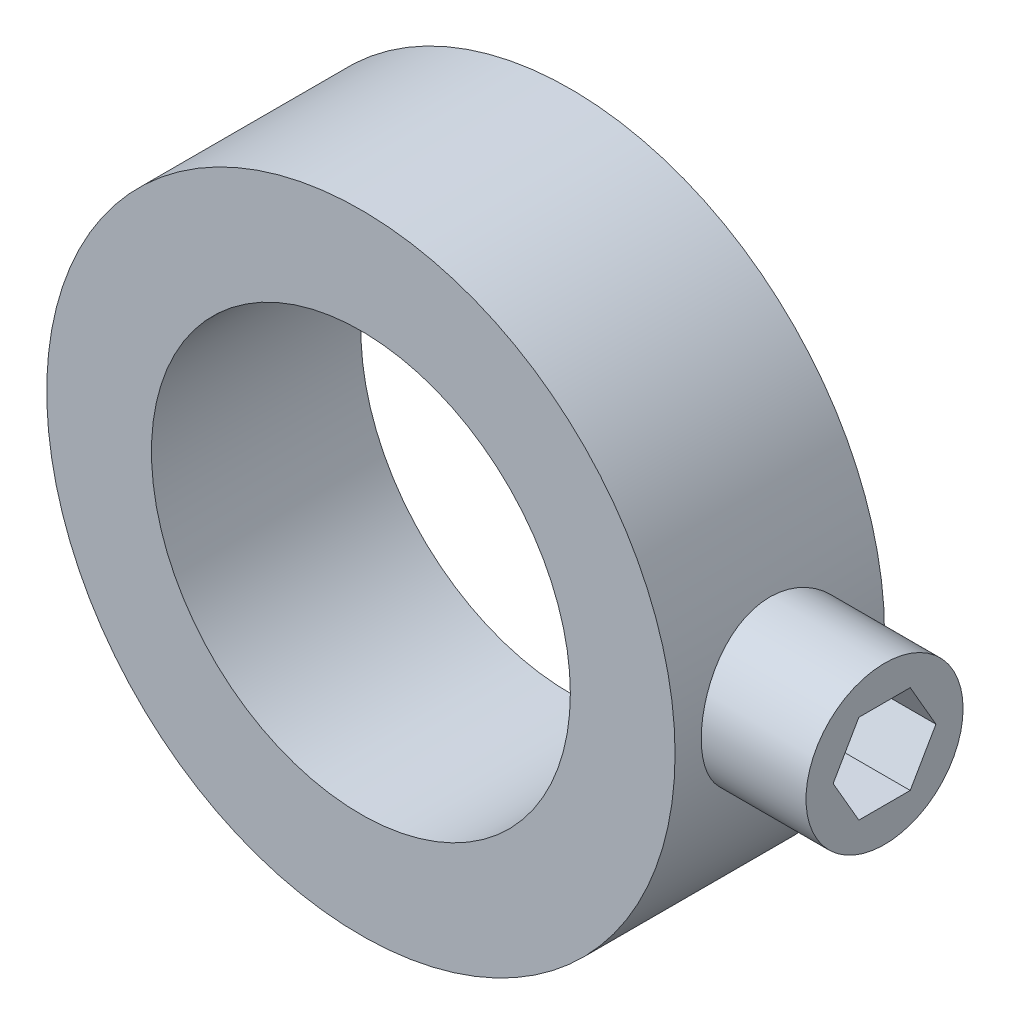
ISO-10303-21;
HEADER;
FILE_DESCRIPTION(('STEP AP214'),'2;1');
FILE_NAME('part.step','',(''),(''),'','','');
FILE_SCHEMA(('AUTOMOTIVE_DESIGN { 1 0 10303 214 1 1 1 1 }'));
ENDSEC;
DATA;
#1=APPLICATION_CONTEXT('core data for automotive mechanical design processes');
#2=APPLICATION_PROTOCOL_DEFINITION('international standard','automotive_design',2000,#1);
#3=PRODUCT_CONTEXT('',#1,'mechanical');
#4=PRODUCT('Part','Part','',(#3));
#5=PRODUCT_RELATED_PRODUCT_CATEGORY('part','',(#4));
#6=PRODUCT_DEFINITION_FORMATION('','',#4);
#7=PRODUCT_DEFINITION_CONTEXT('part definition',#1,'design');
#8=PRODUCT_DEFINITION('design','',#6,#7);
#9=PRODUCT_DEFINITION_SHAPE('','',#8);
#10=(LENGTH_UNIT() NAMED_UNIT(*) SI_UNIT(.MILLI.,.METRE.));
#11=(NAMED_UNIT(*) PLANE_ANGLE_UNIT() SI_UNIT($,.RADIAN.));
#12=(NAMED_UNIT(*) SI_UNIT($,.STERADIAN.) SOLID_ANGLE_UNIT());
#13=UNCERTAINTY_MEASURE_WITH_UNIT(LENGTH_MEASURE(1.E-05),#10,'distance_accuracy_value','');
#14=(GEOMETRIC_REPRESENTATION_CONTEXT(3) GLOBAL_UNCERTAINTY_ASSIGNED_CONTEXT((#13)) GLOBAL_UNIT_ASSIGNED_CONTEXT((#10,
#11,#12)) REPRESENTATION_CONTEXT('',''));
#15=CARTESIAN_POINT('',(0.,0.,0.));
#16=DIRECTION('',(0.,0.,1.));
#17=DIRECTION('',(1.,0.,0.));
#18=AXIS2_PLACEMENT_3D('',#15,#16,#17);
#19=CARTESIAN_POINT('',(0.,0.,4.));
#20=DIRECTION('',(0.,0.,1.));
#21=DIRECTION('',(1.,0.,0.));
#22=AXIS2_PLACEMENT_3D('',#19,#20,#21);
#23=PLANE('',#22);
#24=CARTESIAN_POINT('',(0.,0.,4.));
#25=DIRECTION('',(0.,0.,1.));
#26=DIRECTION('',(1.,0.,0.));
#27=AXIS2_PLACEMENT_3D('',#24,#25,#26);
#28=CIRCLE('',#27,6.);
#29=CARTESIAN_POINT('',(6.,0.,4.));
#30=VERTEX_POINT('',#29);
#31=EDGE_CURVE('E11',#30,#30,#28,.T.);
#32=ORIENTED_EDGE('',*,*,#31,.T.);
#33=EDGE_LOOP('',(#32));
#34=FACE_BOUND('',#33,.T.);
#35=CARTESIAN_POINT('',(0.,0.,4.));
#36=DIRECTION('',(0.,0.,1.));
#37=DIRECTION('',(1.,0.,0.));
#38=AXIS2_PLACEMENT_3D('',#35,#36,#37);
#39=CIRCLE('',#38,4.);
#40=CARTESIAN_POINT('',(4.,0.,4.));
#41=VERTEX_POINT('',#40);
#42=EDGE_CURVE('E151',#41,#41,#39,.T.);
#43=ORIENTED_EDGE('',*,*,#42,.F.);
#44=EDGE_LOOP('',(#43));
#45=FACE_BOUND('',#44,.T.);
#46=ADVANCED_FACE('F35',(#34,#45),#23,.T.);
#47=CARTESIAN_POINT('',(0.,0.,0.));
#48=DIRECTION('',(0.,0.,1.));
#49=DIRECTION('',(1.,0.,0.));
#50=AXIS2_PLACEMENT_3D('',#47,#48,#49);
#51=PLANE('',#50);
#52=CARTESIAN_POINT('',(0.,0.,0.));
#53=DIRECTION('',(0.,0.,1.));
#54=DIRECTION('',(1.,0.,0.));
#55=AXIS2_PLACEMENT_3D('',#52,#53,#54);
#56=CIRCLE('',#55,6.);
#57=CARTESIAN_POINT('',(6.,0.,0.));
#58=VERTEX_POINT('',#57);
#59=EDGE_CURVE('E48',#58,#58,#56,.T.);
#60=ORIENTED_EDGE('',*,*,#59,.F.);
#61=EDGE_LOOP('',(#60));
#62=FACE_BOUND('',#61,.T.);
#63=CARTESIAN_POINT('',(0.,0.,0.));
#64=DIRECTION('',(0.,0.,1.));
#65=DIRECTION('',(1.,0.,0.));
#66=AXIS2_PLACEMENT_3D('',#63,#64,#65);
#67=CIRCLE('',#66,4.);
#68=CARTESIAN_POINT('',(4.,0.,0.));
#69=VERTEX_POINT('',#68);
#70=EDGE_CURVE('E154',#69,#69,#67,.T.);
#71=ORIENTED_EDGE('',*,*,#70,.T.);
#72=EDGE_LOOP('',(#71));
#73=FACE_BOUND('',#72,.T.);
#74=ADVANCED_FACE('F160',(#62,#73),#51,.F.);
#75=CARTESIAN_POINT('',(0.,0.,4.));
#76=DIRECTION('',(0.,0.,-1.));
#77=DIRECTION('',(-1.,0.,0.));
#78=AXIS2_PLACEMENT_3D('',#75,#76,#77);
#79=CYLINDRICAL_SURFACE('',#78,6.);
#80=CARTESIAN_POINT('',(6.,0.,0.499999999999998));
#81=CARTESIAN_POINT('',(5.99999859868013,-0.0828760886697311,0.500002325738157));
#82=CARTESIAN_POINT('',(5.99826578131828,-0.165778157830763,0.506891550773786));
#83=CARTESIAN_POINT('',(5.99152113829892,-0.329206323770533,0.534225151307003));
#84=CARTESIAN_POINT('',(5.98650745419968,-0.409731046870739,0.554677209537846));
#85=CARTESIAN_POINT('',(5.9737562633204,-0.566020872182577,0.608439253462086));
#86=CARTESIAN_POINT('',(5.96602202842087,-0.641791563430003,0.641733798715276));
#87=CARTESIAN_POINT('',(5.94865343807593,-0.786672131904427,0.720181390044832));
#88=CARTESIAN_POINT('',(5.9390190185405,-0.85578178434876,0.765334836118935));
#89=CARTESIAN_POINT('',(5.91867413591801,-0.98680192730092,0.86720078965421));
#90=CARTESIAN_POINT('',(5.90794707148533,-1.04855569006107,0.924111574959177));
#91=CARTESIAN_POINT('',(5.8867362011753,-1.1617489272033,1.04745220490892));
#92=CARTESIAN_POINT('',(5.87625242288348,-1.21318723694913,1.1138831229465));
#93=CARTESIAN_POINT('',(5.8565477569971,-1.30502654279903,1.25559522673744));
#94=CARTESIAN_POINT('',(5.84734794470605,-1.34525221592536,1.3309932308104));
#95=CARTESIAN_POINT('',(5.83149494812223,-1.41239690855053,1.48774841165836));
#96=CARTESIAN_POINT('',(5.82484135672789,-1.43931805543933,1.56910463332576));
#97=CARTESIAN_POINT('',(5.81500476717551,-1.47855483680429,1.73374349820247));
#98=CARTESIAN_POINT('',(5.81175491075426,-1.49115226833334,1.8169548960498));
#99=CARTESIAN_POINT('',(5.80889362537741,-1.50226177506785,1.98436856901398));
#100=CARTESIAN_POINT('',(5.80928160448644,-1.50077614181798,2.06857068069861));
#101=CARTESIAN_POINT('',(5.81359205496618,-1.48398652463928,2.23341580774448));
#102=CARTESIAN_POINT('',(5.81742863001879,-1.46901834019052,2.31409562146509));
#103=CARTESIAN_POINT('',(5.82806709676484,-1.42622418690311,2.47176105091129));
#104=CARTESIAN_POINT('',(5.83486919970696,-1.39839730206942,2.54874640302898));
#105=CARTESIAN_POINT('',(5.85075113904187,-1.33038947793715,2.69773801625206));
#106=CARTESIAN_POINT('',(5.85985327469421,-1.29008666723291,2.76968617178955));
#107=CARTESIAN_POINT('',(5.87929710846386,-1.19835627601495,2.90591870975684));
#108=CARTESIAN_POINT('',(5.88963902334735,-1.14692674880884,2.97020174806725));
#109=CARTESIAN_POINT('',(5.91075880539781,-1.03266342468122,3.0912036156944));
#110=CARTESIAN_POINT('',(5.92154069477971,-0.96954625816586,3.14765449006135));
#111=CARTESIAN_POINT('',(5.94205965578786,-0.8346119175037,3.2492212424639));
#112=CARTESIAN_POINT('',(5.95179669549415,-0.762794477707944,3.29433677426356));
#113=CARTESIAN_POINT('',(5.96917732094183,-0.612115888681392,3.37205058622438));
#114=CARTESIAN_POINT('',(5.97681360127725,-0.533231393208623,3.40460534025443));
#115=CARTESIAN_POINT('',(5.98907916991419,-0.370876008142883,3.45591730570957));
#116=CARTESIAN_POINT('',(5.99370903339281,-0.287405999150485,3.47467715641814));
#117=CARTESIAN_POINT('',(5.99935499271375,-0.120539970390027,3.49745756555884));
#118=CARTESIAN_POINT('',(6.00046053508279,-0.0371967199882103,3.5018430260753));
#119=CARTESIAN_POINT('',(5.99918804814451,0.129032874801508,3.49675099794451));
#120=CARTESIAN_POINT('',(5.99681033241847,0.211919259644595,3.48727475720087));
#121=CARTESIAN_POINT('',(5.98889581127357,0.373614268776491,3.45502909160862));
#122=CARTESIAN_POINT('',(5.98340634185811,0.452465118968754,3.43245873652301));
#123=CARTESIAN_POINT('',(5.96988706634134,0.605257292452511,3.37489291597155));
#124=CARTESIAN_POINT('',(5.96185700369892,0.679198119032634,3.33989619568683));
#125=CARTESIAN_POINT('',(5.94393307926311,0.821523134429847,3.25776387112527));
#126=CARTESIAN_POINT('',(5.93400867366932,0.88978544183583,3.21042388760324));
#127=CARTESIAN_POINT('',(5.91344509187419,1.01752661364325,3.10521009120303));
#128=CARTESIAN_POINT('',(5.90280579251705,1.07700395897301,3.04733446038309));
#129=CARTESIAN_POINT('',(5.88168956960771,1.18699056807273,2.92099803915553));
#130=CARTESIAN_POINT('',(5.87122304187281,1.23724386762203,2.85231229699758));
#131=CARTESIAN_POINT('',(5.85192878377239,1.3255107590127,2.70726736553428));
#132=CARTESIAN_POINT('',(5.84310098067026,1.36352489415794,2.63090851704025));
#133=CARTESIAN_POINT('',(5.82818094734665,1.42595142060929,2.47309427758692));
#134=CARTESIAN_POINT('',(5.82207255291906,1.45044439665406,2.39167237165599));
#135=CARTESIAN_POINT('',(5.81326744090184,1.48534565995378,2.22569036211089));
#136=CARTESIAN_POINT('',(5.81056997719936,1.49575702747866,2.14113094896751));
#137=CARTESIAN_POINT('',(5.80894901203957,1.50203859033399,1.9738789761448));
#138=CARTESIAN_POINT('',(5.80991932728264,1.49831789778012,1.89120256487527));
#139=CARTESIAN_POINT('',(5.81527909007843,1.47737727831287,1.72769611133202));
#140=CARTESIAN_POINT('',(5.81966846891857,1.46015762268677,1.64686603198635));
#141=CARTESIAN_POINT('',(5.83131260682723,1.41293131944279,1.48979154093459));
#142=CARTESIAN_POINT('',(5.8385501523631,1.38300140468038,1.41352269475979));
#143=CARTESIAN_POINT('',(5.85507755724829,1.31126491360507,1.26703461728631));
#144=CARTESIAN_POINT('',(5.86436770120773,1.26945669003419,1.19681622681308));
#145=CARTESIAN_POINT('',(5.88425634263512,1.17386774863714,1.06244537099798));
#146=CARTESIAN_POINT('',(5.89488264831757,1.11980316291225,0.998498926576039));
#147=CARTESIAN_POINT('',(5.91608027246286,1.00178937118974,0.880452955204591));
#148=CARTESIAN_POINT('',(5.9266515772706,0.937837821261146,0.82635576988703));
#149=CARTESIAN_POINT('',(5.94677655647663,0.80046758670259,0.728588691435392));
#150=CARTESIAN_POINT('',(5.95630833365868,0.726898422316387,0.68512538632842));
#151=CARTESIAN_POINT('',(5.97304924975118,0.573266059510476,0.611252537059468));
#152=CARTESIAN_POINT('',(5.98026005199781,0.49320756343674,0.580833639351462));
#153=CARTESIAN_POINT('',(5.99048059565542,0.344410253243472,0.538428169670345));
#154=CARTESIAN_POINT('',(5.99402585052691,0.276380170908069,0.524048756946565));
#155=CARTESIAN_POINT('',(5.99878605231948,0.138906071536284,0.504834056378057));
#156=CARTESIAN_POINT('',(6.00000117450894,0.0694621612426164,0.499998050694697));
#157=CARTESIAN_POINT('',(6.,0.,0.499999999999998));
#158=B_SPLINE_CURVE_WITH_KNOTS('',3,(#80,#81,#82,#83,#84,#85,#86,#87,#88,#89,#90,#91,#92,#93,
#94,#95,#96,#97,#98,#99,#100,#101,#102,#103,#104,#105,#106,#107,#108,#109,#110,#111,#112,#113,
#114,#115,#116,#117,#118,#119,#120,#121,#122,#123,#124,#125,#126,#127,#128,#129,#130,#131,#132,
#133,#134,#135,#136,#137,#138,#139,#140,#141,#142,#143,#144,#145,#146,#147,#148,#149,#150,#151,
#152,#153,#154,#155,#156,#157),.UNSPECIFIED.,.T.,.F.,(4,2,2,2,2,2,2,2,2,2,2,2,2,2,2,2,2,2,2,2,2,
2,2,2,2,2,2,2,2,2,2,2,2,2,2,2,2,2,4),(0.,0.24837371247189,0.4968882377639,0.745104902286106,
0.993329940169329,1.24614435437139,1.49898729580062,1.75558647545807,2.01214461169368,
2.2635629509943,2.51494038112697,2.76022497007018,3.00552703466038,3.25330527873879,
3.50112690836163,3.75601500969019,4.01091089558247,4.26668229009114,4.52240473688643,
4.77158308949276,5.02073901112743,5.26620274514037,5.5116912732229,5.76153587565352,
6.01142363008019,6.26744509204476,6.52345518749508,6.77792254614036,7.03233423252408,
7.27943780398612,7.52653640956034,7.77216400559447,8.01782568136901,8.2698957640991,
8.52202569770418,8.77872185499588,9.0352336382135,9.24342242942149,9.4515955604304),.UNSPECIFIED.);
#159=CARTESIAN_POINT('',(6.,0.,0.499999999999998));
#160=VERTEX_POINT('',#159);
#161=EDGE_CURVE('E40',#160,#160,#158,.T.);
#162=ORIENTED_EDGE('',*,*,#161,.T.);
#163=EDGE_LOOP('',(#162));
#164=FACE_BOUND('',#163,.T.);
#165=ORIENTED_EDGE('',*,*,#31,.F.);
#166=EDGE_LOOP('',(#165));
#167=FACE_BOUND('',#166,.T.);
#168=ORIENTED_EDGE('',*,*,#59,.T.);
#169=EDGE_LOOP('',(#168));
#170=FACE_BOUND('',#169,.T.);
#171=ADVANCED_FACE('F37',(#164,#167,#170),#79,.T.);
#172=CARTESIAN_POINT('',(0.,0.,4.));
#173=DIRECTION('',(0.,0.,-1.));
#174=DIRECTION('',(-1.,0.,0.));
#175=AXIS2_PLACEMENT_3D('',#172,#173,#174);
#176=CYLINDRICAL_SURFACE('',#175,4.);
#177=ORIENTED_EDGE('',*,*,#42,.T.);
#178=EDGE_LOOP('',(#177));
#179=FACE_BOUND('',#178,.T.);
#180=ORIENTED_EDGE('',*,*,#70,.F.);
#181=EDGE_LOOP('',(#180));
#182=FACE_BOUND('',#181,.T.);
#183=ADVANCED_FACE('F165',(#179,#182),#176,.F.);
#184=CARTESIAN_POINT('',(5.,0.,2.));
#185=DIRECTION('',(1.,0.,0.));
#186=DIRECTION('',(0.,0.,-1.));
#187=AXIS2_PLACEMENT_3D('',#184,#185,#186);
#188=CYLINDRICAL_SURFACE('',#187,1.5);
#189=CARTESIAN_POINT('',(8.,0.,2.));
#190=DIRECTION('',(1.,0.,0.));
#191=DIRECTION('',(0.,0.,-1.));
#192=AXIS2_PLACEMENT_3D('',#189,#190,#191);
#193=CIRCLE('',#192,1.5);
#194=CARTESIAN_POINT('',(8.,0.,0.499999999999998));
#195=VERTEX_POINT('',#194);
#196=EDGE_CURVE('E143',#195,#195,#193,.T.);
#197=ORIENTED_EDGE('',*,*,#196,.F.);
#198=EDGE_LOOP('',(#197));
#199=FACE_BOUND('',#198,.T.);
#200=ORIENTED_EDGE('',*,*,#161,.F.);
#201=EDGE_LOOP('',(#200));
#202=FACE_BOUND('',#201,.T.);
#203=ADVANCED_FACE('F167',(#199,#202),#188,.T.);
#204=CARTESIAN_POINT('',(8.,0.,2.));
#205=DIRECTION('',(1.,0.,0.));
#206=DIRECTION('',(0.,0.,-1.));
#207=AXIS2_PLACEMENT_3D('',#204,#205,#206);
#208=PLANE('',#207);
#209=DIRECTION('',(0.,-0.866025403784443,0.499999999999992));
#210=VECTOR('',#209,1.);
#211=CARTESIAN_POINT('',(8.,0.85,2.49074772881119));
#212=LINE('',#211,#210);
#213=CARTESIAN_POINT('',(8.,0.85,2.49074772881119));
#214=VERTEX_POINT('',#213);
#215=CARTESIAN_POINT('',(8.,0.,2.98149545762236));
#216=VERTEX_POINT('',#215);
#217=EDGE_CURVE('E56',#214,#216,#212,.T.);
#218=ORIENTED_EDGE('',*,*,#217,.F.);
#219=DIRECTION('',(0.,0.,1.));
#220=VECTOR('',#219,1.);
#221=CARTESIAN_POINT('',(8.,0.85,2.49074772881119));
#222=LINE('',#221,#220);
#223=CARTESIAN_POINT('',(8.,0.85,1.50925227118883));
#224=VERTEX_POINT('',#223);
#225=EDGE_CURVE('E139',#224,#214,#222,.T.);
#226=ORIENTED_EDGE('',*,*,#225,.F.);
#227=DIRECTION('',(0.,0.866025403784436,0.500000000000004));
#228=VECTOR('',#227,1.);
#229=CARTESIAN_POINT('',(8.,0.,1.01850454237764));
#230=LINE('',#229,#228);
#231=CARTESIAN_POINT('',(8.,0.,1.01850454237764));
#232=VERTEX_POINT('',#231);
#233=EDGE_CURVE('E137',#232,#224,#230,.T.);
#234=ORIENTED_EDGE('',*,*,#233,.F.);
#235=DIRECTION('',(0.,0.866025403784443,-0.499999999999992));
#236=VECTOR('',#235,1.);
#237=CARTESIAN_POINT('',(8.,-0.85,1.50925227118881));
#238=LINE('',#237,#236);
#239=CARTESIAN_POINT('',(8.,-0.85,1.50925227118881));
#240=VERTEX_POINT('',#239);
#241=EDGE_CURVE('E104',#240,#232,#238,.T.);
#242=ORIENTED_EDGE('',*,*,#241,.F.);
#243=DIRECTION('',(0.,0.,-1.));
#244=VECTOR('',#243,1.);
#245=CARTESIAN_POINT('',(8.,-0.85,2.49074772881117));
#246=LINE('',#245,#244);
#247=CARTESIAN_POINT('',(8.,-0.85,2.49074772881117));
#248=VERTEX_POINT('',#247);
#249=EDGE_CURVE('E133',#248,#240,#246,.T.);
#250=ORIENTED_EDGE('',*,*,#249,.F.);
#251=DIRECTION('',(0.,-0.866025403784436,-0.500000000000004));
#252=VECTOR('',#251,1.);
#253=CARTESIAN_POINT('',(8.,0.,2.98149545762236));
#254=LINE('',#253,#252);
#255=EDGE_CURVE('E130',#216,#248,#254,.T.);
#256=ORIENTED_EDGE('',*,*,#255,.F.);
#257=EDGE_LOOP('',(#218,#226,#234,#242,#250,#256));
#258=FACE_BOUND('',#257,.T.);
#259=ORIENTED_EDGE('',*,*,#196,.T.);
#260=EDGE_LOOP('',(#259));
#261=FACE_BOUND('',#260,.T.);
#262=ADVANCED_FACE('F174',(#258,#261),#208,.T.);
#263=CARTESIAN_POINT('',(6.5,0.85,2.49074772881119));
#264=DIRECTION('',(0.,0.499999999999992,0.866025403784443));
#265=DIRECTION('',(0.,-0.866025403784444,0.499999999999992));
#266=AXIS2_PLACEMENT_3D('',#263,#264,#265);
#267=PLANE('',#266);
#268=ORIENTED_EDGE('',*,*,#217,.T.);
#269=DIRECTION('',(1.,0.,0.));
#270=VECTOR('',#269,1.);
#271=CARTESIAN_POINT('',(6.5,0.,2.98149545762236));
#272=LINE('',#271,#270);
#273=CARTESIAN_POINT('',(6.5,0.,2.98149545762236));
#274=VERTEX_POINT('',#273);
#275=EDGE_CURVE('E86',#274,#216,#272,.T.);
#276=ORIENTED_EDGE('',*,*,#275,.F.);
#277=DIRECTION('',(0.,-0.866025403784443,0.499999999999992));
#278=VECTOR('',#277,1.);
#279=CARTESIAN_POINT('',(6.5,0.85,2.49074772881119));
#280=LINE('',#279,#278);
#281=CARTESIAN_POINT('',(6.5,0.85,2.49074772881119));
#282=VERTEX_POINT('',#281);
#283=EDGE_CURVE('E141',#282,#274,#280,.T.);
#284=ORIENTED_EDGE('',*,*,#283,.F.);
#285=DIRECTION('',(1.,0.,0.));
#286=VECTOR('',#285,1.);
#287=CARTESIAN_POINT('',(6.5,0.85,2.49074772881119));
#288=LINE('',#287,#286);
#289=EDGE_CURVE('E64',#282,#214,#288,.T.);
#290=ORIENTED_EDGE('',*,*,#289,.T.);
#291=EDGE_LOOP('',(#268,#276,#284,#290));
#292=FACE_BOUND('',#291,.T.);
#293=ADVANCED_FACE('F211',(#292),#267,.F.);
#294=CARTESIAN_POINT('',(6.5,0.85,2.49074772881119));
#295=DIRECTION('',(0.,1.,0.));
#296=DIRECTION('',(0.,0.,1.));
#297=AXIS2_PLACEMENT_3D('',#294,#295,#296);
#298=PLANE('',#297);
#299=ORIENTED_EDGE('',*,*,#225,.T.);
#300=ORIENTED_EDGE('',*,*,#289,.F.);
#301=DIRECTION('',(0.,0.,1.));
#302=VECTOR('',#301,1.);
#303=CARTESIAN_POINT('',(6.5,0.85,2.49074772881119));
#304=LINE('',#303,#302);
#305=CARTESIAN_POINT('',(6.5,0.85,1.50925227118883));
#306=VERTEX_POINT('',#305);
#307=EDGE_CURVE('E116',#306,#282,#304,.T.);
#308=ORIENTED_EDGE('',*,*,#307,.F.);
#309=DIRECTION('',(1.,0.,0.));
#310=VECTOR('',#309,1.);
#311=CARTESIAN_POINT('',(6.5,0.85,1.50925227118883));
#312=LINE('',#311,#310);
#313=EDGE_CURVE('E108',#306,#224,#312,.T.);
#314=ORIENTED_EDGE('',*,*,#313,.T.);
#315=EDGE_LOOP('',(#299,#300,#308,#314));
#316=FACE_BOUND('',#315,.T.);
#317=ADVANCED_FACE('F221',(#316),#298,.F.);
#318=CARTESIAN_POINT('',(6.5,0.,1.01850454237764));
#319=DIRECTION('',(0.,0.500000000000004,-0.866025403784436));
#320=DIRECTION('',(0.,0.866025403784436,0.500000000000004));
#321=AXIS2_PLACEMENT_3D('',#318,#319,#320);
#322=PLANE('',#321);
#323=ORIENTED_EDGE('',*,*,#233,.T.);
#324=ORIENTED_EDGE('',*,*,#313,.F.);
#325=DIRECTION('',(0.,0.866025403784436,0.500000000000004));
#326=VECTOR('',#325,1.);
#327=CARTESIAN_POINT('',(6.5,0.,1.01850454237764));
#328=LINE('',#327,#326);
#329=CARTESIAN_POINT('',(6.5,0.,1.01850454237764));
#330=VERTEX_POINT('',#329);
#331=EDGE_CURVE('E112',#330,#306,#328,.T.);
#332=ORIENTED_EDGE('',*,*,#331,.F.);
#333=DIRECTION('',(1.,0.,0.));
#334=VECTOR('',#333,1.);
#335=CARTESIAN_POINT('',(6.5,0.,1.01850454237764));
#336=LINE('',#335,#334);
#337=EDGE_CURVE('E97',#330,#232,#336,.T.);
#338=ORIENTED_EDGE('',*,*,#337,.T.);
#339=EDGE_LOOP('',(#323,#324,#332,#338));
#340=FACE_BOUND('',#339,.T.);
#341=ADVANCED_FACE('F113',(#340),#322,.F.);
#342=CARTESIAN_POINT('',(6.5,-0.85,1.50925227118881));
#343=DIRECTION('',(0.,-0.499999999999992,-0.866025403784443));
#344=DIRECTION('',(0.,0.866025403784443,-0.499999999999992));
#345=AXIS2_PLACEMENT_3D('',#342,#343,#344);
#346=PLANE('',#345);
#347=ORIENTED_EDGE('',*,*,#241,.T.);
#348=ORIENTED_EDGE('',*,*,#337,.F.);
#349=DIRECTION('',(0.,0.866025403784443,-0.499999999999992));
#350=VECTOR('',#349,1.);
#351=CARTESIAN_POINT('',(6.5,-0.85,1.50925227118881));
#352=LINE('',#351,#350);
#353=CARTESIAN_POINT('',(6.5,-0.85,1.50925227118881));
#354=VERTEX_POINT('',#353);
#355=EDGE_CURVE('E101',#354,#330,#352,.T.);
#356=ORIENTED_EDGE('',*,*,#355,.F.);
#357=DIRECTION('',(1.,0.,0.));
#358=VECTOR('',#357,1.);
#359=CARTESIAN_POINT('',(6.5,-0.85,1.50925227118881));
#360=LINE('',#359,#358);
#361=EDGE_CURVE('E109',#354,#240,#360,.T.);
#362=ORIENTED_EDGE('',*,*,#361,.T.);
#363=EDGE_LOOP('',(#347,#348,#356,#362));
#364=FACE_BOUND('',#363,.T.);
#365=ADVANCED_FACE('F99',(#364),#346,.F.);
#366=CARTESIAN_POINT('',(6.5,-0.85,2.49074772881117));
#367=DIRECTION('',(0.,-1.,0.));
#368=DIRECTION('',(0.,0.,-1.));
#369=AXIS2_PLACEMENT_3D('',#366,#367,#368);
#370=PLANE('',#369);
#371=ORIENTED_EDGE('',*,*,#249,.T.);
#372=ORIENTED_EDGE('',*,*,#361,.F.);
#373=DIRECTION('',(0.,0.,-1.));
#374=VECTOR('',#373,1.);
#375=CARTESIAN_POINT('',(6.5,-0.85,2.49074772881117));
#376=LINE('',#375,#374);
#377=CARTESIAN_POINT('',(6.5,-0.85,2.49074772881117));
#378=VERTEX_POINT('',#377);
#379=EDGE_CURVE('E122',#378,#354,#376,.T.);
#380=ORIENTED_EDGE('',*,*,#379,.F.);
#381=DIRECTION('',(1.,0.,0.));
#382=VECTOR('',#381,1.);
#383=CARTESIAN_POINT('',(6.5,-0.85,2.49074772881117));
#384=LINE('',#383,#382);
#385=EDGE_CURVE('E146',#378,#248,#384,.T.);
#386=ORIENTED_EDGE('',*,*,#385,.T.);
#387=EDGE_LOOP('',(#371,#372,#380,#386));
#388=FACE_BOUND('',#387,.T.);
#389=ADVANCED_FACE('F246',(#388),#370,.F.);
#390=CARTESIAN_POINT('',(6.5,0.,2.98149545762236));
#391=DIRECTION('',(0.,-0.500000000000004,0.866025403784436));
#392=DIRECTION('',(0.,-0.866025403784436,-0.500000000000004));
#393=AXIS2_PLACEMENT_3D('',#390,#391,#392);
#394=PLANE('',#393);
#395=ORIENTED_EDGE('',*,*,#255,.T.);
#396=ORIENTED_EDGE('',*,*,#385,.F.);
#397=DIRECTION('',(0.,-0.866025403784436,-0.500000000000004));
#398=VECTOR('',#397,1.);
#399=CARTESIAN_POINT('',(6.5,0.,2.98149545762236));
#400=LINE('',#399,#398);
#401=EDGE_CURVE('E124',#274,#378,#400,.T.);
#402=ORIENTED_EDGE('',*,*,#401,.F.);
#403=ORIENTED_EDGE('',*,*,#275,.T.);
#404=EDGE_LOOP('',(#395,#396,#402,#403));
#405=FACE_BOUND('',#404,.T.);
#406=ADVANCED_FACE('F255',(#405),#394,.F.);
#407=CARTESIAN_POINT('',(6.5,0.,2.98149545762236));
#408=DIRECTION('',(1.,0.,0.));
#409=DIRECTION('',(0.,0.,-1.));
#410=AXIS2_PLACEMENT_3D('',#407,#408,#409);
#411=PLANE('',#410);
#412=ORIENTED_EDGE('',*,*,#283,.T.);
#413=ORIENTED_EDGE('',*,*,#401,.T.);
#414=ORIENTED_EDGE('',*,*,#379,.T.);
#415=ORIENTED_EDGE('',*,*,#355,.T.);
#416=ORIENTED_EDGE('',*,*,#331,.T.);
#417=ORIENTED_EDGE('',*,*,#307,.T.);
#418=EDGE_LOOP('',(#412,#413,#414,#415,#416,#417));
#419=FACE_BOUND('',#418,.T.);
#420=ADVANCED_FACE('F119',(#419),#411,.T.);
#421=CLOSED_SHELL('',(#46,#74,#171,#183,#203,#262,#293,#317,#341,#365,#389,#406,#420));
#422=MANIFOLD_SOLID_BREP('B2',#421);
#423=ADVANCED_BREP_SHAPE_REPRESENTATION('',(#18,#422),#14);
#424=SHAPE_DEFINITION_REPRESENTATION(#9,#423);
ENDSEC;
END-ISO-10303-21;
